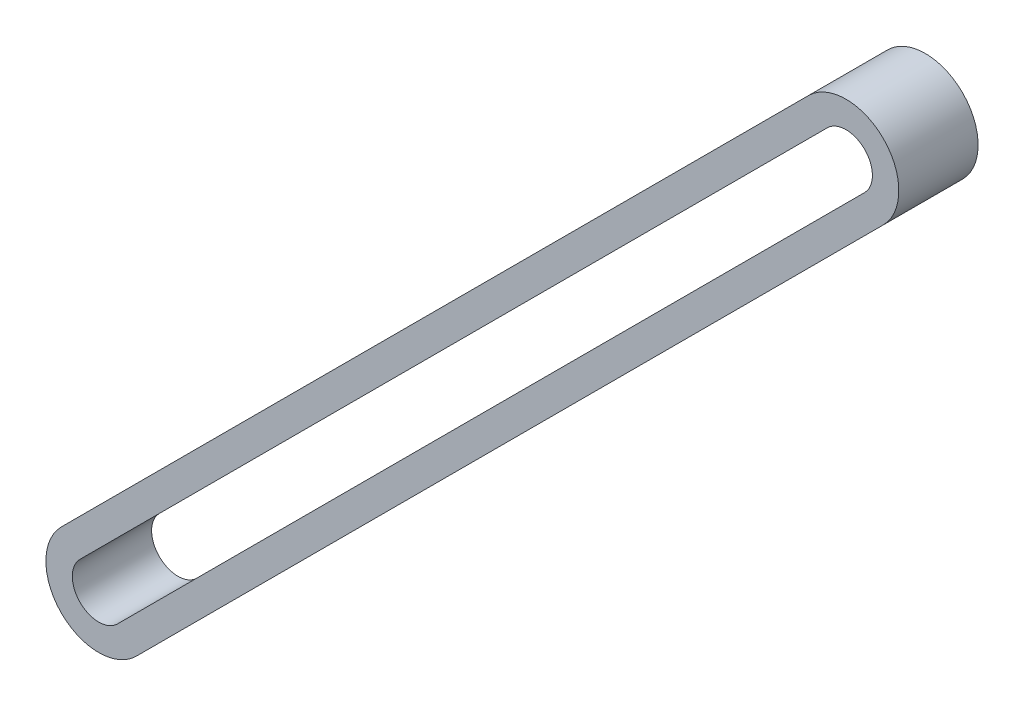
ISO-10303-21;
HEADER;
FILE_DESCRIPTION(('STEP AP214'),'2;1');
FILE_NAME('part.step','',(''),(''),'','','');
FILE_SCHEMA(('AUTOMOTIVE_DESIGN { 1 0 10303 214 1 1 1 1 }'));
ENDSEC;
DATA;
#1=APPLICATION_CONTEXT('core data for automotive mechanical design processes');
#2=APPLICATION_PROTOCOL_DEFINITION('international standard','automotive_design',2000,#1);
#3=PRODUCT_CONTEXT('',#1,'mechanical');
#4=PRODUCT('Part','Part','',(#3));
#5=PRODUCT_RELATED_PRODUCT_CATEGORY('part','',(#4));
#6=PRODUCT_DEFINITION_FORMATION('','',#4);
#7=PRODUCT_DEFINITION_CONTEXT('part definition',#1,'design');
#8=PRODUCT_DEFINITION('design','',#6,#7);
#9=PRODUCT_DEFINITION_SHAPE('','',#8);
#10=(LENGTH_UNIT() NAMED_UNIT(*) SI_UNIT(.MILLI.,.METRE.));
#11=(NAMED_UNIT(*) PLANE_ANGLE_UNIT() SI_UNIT($,.RADIAN.));
#12=(NAMED_UNIT(*) SI_UNIT($,.STERADIAN.) SOLID_ANGLE_UNIT());
#13=UNCERTAINTY_MEASURE_WITH_UNIT(LENGTH_MEASURE(1.E-05),#10,'distance_accuracy_value','');
#14=(GEOMETRIC_REPRESENTATION_CONTEXT(3) GLOBAL_UNCERTAINTY_ASSIGNED_CONTEXT((#13)) GLOBAL_UNIT_ASSIGNED_CONTEXT((#10,
#11,#12)) REPRESENTATION_CONTEXT('',''));
#15=CARTESIAN_POINT('',(0.,0.,0.));
#16=DIRECTION('',(0.,0.,1.));
#17=DIRECTION('',(1.,0.,0.));
#18=AXIS2_PLACEMENT_3D('',#15,#16,#17);
#19=CARTESIAN_POINT('',(0.,0.,3.));
#20=DIRECTION('',(0.,0.,1.));
#21=DIRECTION('',(1.,0.,0.));
#22=AXIS2_PLACEMENT_3D('',#19,#20,#21);
#23=PLANE('',#22);
#24=CARTESIAN_POINT('',(0.,0.,3.));
#25=DIRECTION('',(0.,0.,1.));
#26=DIRECTION('',(1.,0.,0.));
#27=AXIS2_PLACEMENT_3D('',#24,#25,#26);
#28=CIRCLE('',#27,2.);
#29=CARTESIAN_POINT('',(-1.4142135623731,1.41421356237309,3.));
#30=VERTEX_POINT('',#29);
#31=CARTESIAN_POINT('',(1.4142135623731,-1.41421356237309,3.));
#32=VERTEX_POINT('',#31);
#33=EDGE_CURVE('E138',#30,#32,#28,.T.);
#34=ORIENTED_EDGE('',*,*,#33,.T.);
#35=DIRECTION('',(0.707106781186546,0.707106781186549,0.));
#36=VECTOR('',#35,1.);
#37=CARTESIAN_POINT('',(1.4142135623731,-1.41421356237309,3.));
#38=LINE('',#37,#36);
#39=CARTESIAN_POINT('',(29.6984848098349,26.8700576850889,3.));
#40=VERTEX_POINT('',#39);
#41=EDGE_CURVE('E141',#32,#40,#38,.T.);
#42=ORIENTED_EDGE('',*,*,#41,.T.);
#43=CARTESIAN_POINT('',(28.2842712474618,28.284271247462,3.));
#44=DIRECTION('',(0.,0.,1.));
#45=DIRECTION('',(1.,0.,0.));
#46=AXIS2_PLACEMENT_3D('',#43,#44,#45);
#47=CIRCLE('',#46,2.);
#48=CARTESIAN_POINT('',(26.8700576850887,29.6984848098351,3.));
#49=VERTEX_POINT('',#48);
#50=EDGE_CURVE('E144',#40,#49,#47,.T.);
#51=ORIENTED_EDGE('',*,*,#50,.T.);
#52=DIRECTION('',(-0.707106781186546,-0.707106781186549,0.));
#53=VECTOR('',#52,1.);
#54=CARTESIAN_POINT('',(-1.4142135623731,1.41421356237309,3.));
#55=LINE('',#54,#53);
#56=EDGE_CURVE('E146',#49,#30,#55,.T.);
#57=ORIENTED_EDGE('',*,*,#56,.T.);
#58=EDGE_LOOP('',(#34,#42,#51,#57));
#59=FACE_BOUND('',#58,.T.);
#60=DIRECTION('',(0.707106781186546,0.707106781186549,0.));
#61=VECTOR('',#60,1.);
#62=CARTESIAN_POINT('',(0.707106781186549,-0.707106781186546,3.));
#63=LINE('',#62,#61);
#64=CARTESIAN_POINT('',(0.707106781186549,-0.707106781186546,3.));
#65=VERTEX_POINT('',#64);
#66=CARTESIAN_POINT('',(28.9913780286484,27.5771644662754,3.));
#67=VERTEX_POINT('',#66);
#68=EDGE_CURVE('E110',#65,#67,#63,.T.);
#69=ORIENTED_EDGE('',*,*,#68,.F.);
#70=CARTESIAN_POINT('',(0.,0.,3.));
#71=DIRECTION('',(0.,0.,1.));
#72=DIRECTION('',(1.,0.,0.));
#73=AXIS2_PLACEMENT_3D('',#70,#71,#72);
#74=CIRCLE('',#73,1.);
#75=CARTESIAN_POINT('',(-0.707106781186549,0.707106781186546,3.));
#76=VERTEX_POINT('',#75);
#77=EDGE_CURVE('E102',#76,#65,#74,.T.);
#78=ORIENTED_EDGE('',*,*,#77,.F.);
#79=DIRECTION('',(-0.707106781186546,-0.707106781186549,0.));
#80=VECTOR('',#79,1.);
#81=CARTESIAN_POINT('',(-0.707106781186549,0.707106781186546,3.));
#82=LINE('',#81,#80);
#83=CARTESIAN_POINT('',(27.5771644662753,28.9913780286485,3.));
#84=VERTEX_POINT('',#83);
#85=EDGE_CURVE('E124',#84,#76,#82,.T.);
#86=ORIENTED_EDGE('',*,*,#85,.F.);
#87=CARTESIAN_POINT('',(28.2842712474618,28.284271247462,3.));
#88=DIRECTION('',(0.,0.,1.));
#89=DIRECTION('',(1.,0.,0.));
#90=AXIS2_PLACEMENT_3D('',#87,#88,#89);
#91=CIRCLE('',#90,1.);
#92=EDGE_CURVE('E122',#67,#84,#91,.T.);
#93=ORIENTED_EDGE('',*,*,#92,.F.);
#94=EDGE_LOOP('',(#69,#78,#86,#93));
#95=FACE_BOUND('',#94,.T.);
#96=ADVANCED_FACE('F37',(#59,#95),#23,.T.);
#97=CARTESIAN_POINT('',(0.,0.,0.));
#98=DIRECTION('',(0.,0.,1.));
#99=DIRECTION('',(1.,0.,0.));
#100=AXIS2_PLACEMENT_3D('',#97,#98,#99);
#101=PLANE('',#100);
#102=CARTESIAN_POINT('',(0.,0.,0.));
#103=DIRECTION('',(0.,0.,1.));
#104=DIRECTION('',(1.,0.,0.));
#105=AXIS2_PLACEMENT_3D('',#102,#103,#104);
#106=CIRCLE('',#105,2.);
#107=CARTESIAN_POINT('',(-1.4142135623731,1.41421356237309,0.));
#108=VERTEX_POINT('',#107);
#109=CARTESIAN_POINT('',(1.4142135623731,-1.41421356237309,0.));
#110=VERTEX_POINT('',#109);
#111=EDGE_CURVE('E118',#108,#110,#106,.T.);
#112=ORIENTED_EDGE('',*,*,#111,.F.);
#113=DIRECTION('',(-0.707106781186546,-0.707106781186549,0.));
#114=VECTOR('',#113,1.);
#115=CARTESIAN_POINT('',(-1.4142135623731,1.41421356237309,0.));
#116=LINE('',#115,#114);
#117=CARTESIAN_POINT('',(26.8700576850887,29.6984848098351,0.));
#118=VERTEX_POINT('',#117);
#119=EDGE_CURVE('E142',#118,#108,#116,.T.);
#120=ORIENTED_EDGE('',*,*,#119,.F.);
#121=CARTESIAN_POINT('',(28.2842712474618,28.284271247462,0.));
#122=DIRECTION('',(0.,0.,1.));
#123=DIRECTION('',(1.,0.,0.));
#124=AXIS2_PLACEMENT_3D('',#121,#122,#123);
#125=CIRCLE('',#124,2.);
#126=CARTESIAN_POINT('',(29.6984848098349,26.8700576850889,0.));
#127=VERTEX_POINT('',#126);
#128=EDGE_CURVE('E153',#127,#118,#125,.T.);
#129=ORIENTED_EDGE('',*,*,#128,.F.);
#130=DIRECTION('',(0.707106781186546,0.707106781186549,0.));
#131=VECTOR('',#130,1.);
#132=CARTESIAN_POINT('',(1.4142135623731,-1.41421356237309,0.));
#133=LINE('',#132,#131);
#134=EDGE_CURVE('E151',#110,#127,#133,.T.);
#135=ORIENTED_EDGE('',*,*,#134,.F.);
#136=EDGE_LOOP('',(#112,#120,#129,#135));
#137=FACE_BOUND('',#136,.T.);
#138=CARTESIAN_POINT('',(0.,0.,0.));
#139=DIRECTION('',(0.,0.,1.));
#140=DIRECTION('',(1.,0.,0.));
#141=AXIS2_PLACEMENT_3D('',#138,#139,#140);
#142=CIRCLE('',#141,1.);
#143=CARTESIAN_POINT('',(-0.707106781186549,0.707106781186546,0.));
#144=VERTEX_POINT('',#143);
#145=CARTESIAN_POINT('',(0.707106781186549,-0.707106781186546,0.));
#146=VERTEX_POINT('',#145);
#147=EDGE_CURVE('E60',#144,#146,#142,.T.);
#148=ORIENTED_EDGE('',*,*,#147,.T.);
#149=DIRECTION('',(0.707106781186546,0.707106781186549,0.));
#150=VECTOR('',#149,1.);
#151=CARTESIAN_POINT('',(0.707106781186549,-0.707106781186546,0.));
#152=LINE('',#151,#150);
#153=CARTESIAN_POINT('',(28.9913780286484,27.5771644662754,0.));
#154=VERTEX_POINT('',#153);
#155=EDGE_CURVE('E117',#146,#154,#152,.T.);
#156=ORIENTED_EDGE('',*,*,#155,.T.);
#157=CARTESIAN_POINT('',(28.2842712474618,28.284271247462,0.));
#158=DIRECTION('',(0.,0.,1.));
#159=DIRECTION('',(1.,0.,0.));
#160=AXIS2_PLACEMENT_3D('',#157,#158,#159);
#161=CIRCLE('',#160,1.);
#162=CARTESIAN_POINT('',(27.5771644662753,28.9913780286485,0.));
#163=VERTEX_POINT('',#162);
#164=EDGE_CURVE('E130',#154,#163,#161,.T.);
#165=ORIENTED_EDGE('',*,*,#164,.T.);
#166=DIRECTION('',(-0.707106781186546,-0.707106781186549,0.));
#167=VECTOR('',#166,1.);
#168=CARTESIAN_POINT('',(-0.707106781186549,0.707106781186546,0.));
#169=LINE('',#168,#167);
#170=EDGE_CURVE('E111',#163,#144,#169,.T.);
#171=ORIENTED_EDGE('',*,*,#170,.T.);
#172=EDGE_LOOP('',(#148,#156,#165,#171));
#173=FACE_BOUND('',#172,.T.);
#174=ADVANCED_FACE('F171',(#137,#173),#101,.F.);
#175=CARTESIAN_POINT('',(0.,0.,3.));
#176=DIRECTION('',(0.,0.,-1.));
#177=DIRECTION('',(-1.,0.,0.));
#178=AXIS2_PLACEMENT_3D('',#175,#176,#177);
#179=CYLINDRICAL_SURFACE('',#178,2.);
#180=ORIENTED_EDGE('',*,*,#111,.T.);
#181=DIRECTION('',(0.,0.,-1.));
#182=VECTOR('',#181,1.);
#183=CARTESIAN_POINT('',(1.4142135623731,-1.41421356237309,3.));
#184=LINE('',#183,#182);
#185=EDGE_CURVE('E11',#32,#110,#184,.T.);
#186=ORIENTED_EDGE('',*,*,#185,.F.);
#187=ORIENTED_EDGE('',*,*,#33,.F.);
#188=DIRECTION('',(0.,0.,-1.));
#189=VECTOR('',#188,1.);
#190=CARTESIAN_POINT('',(-1.4142135623731,1.41421356237309,3.));
#191=LINE('',#190,#189);
#192=EDGE_CURVE('E148',#30,#108,#191,.T.);
#193=ORIENTED_EDGE('',*,*,#192,.T.);
#194=EDGE_LOOP('',(#180,#186,#187,#193));
#195=FACE_BOUND('',#194,.T.);
#196=ADVANCED_FACE('F39',(#195),#179,.T.);
#197=CARTESIAN_POINT('',(1.4142135623731,-1.41421356237309,3.));
#198=DIRECTION('',(-0.707106781186549,0.707106781186546,0.));
#199=DIRECTION('',(-0.707106781186546,-0.707106781186549,0.));
#200=AXIS2_PLACEMENT_3D('',#197,#198,#199);
#201=PLANE('',#200);
#202=ORIENTED_EDGE('',*,*,#134,.T.);
#203=DIRECTION('',(0.,0.,-1.));
#204=VECTOR('',#203,1.);
#205=CARTESIAN_POINT('',(29.6984848098349,26.8700576850889,3.));
#206=LINE('',#205,#204);
#207=EDGE_CURVE('E45',#40,#127,#206,.T.);
#208=ORIENTED_EDGE('',*,*,#207,.F.);
#209=ORIENTED_EDGE('',*,*,#41,.F.);
#210=ORIENTED_EDGE('',*,*,#185,.T.);
#211=EDGE_LOOP('',(#202,#208,#209,#210));
#212=FACE_BOUND('',#211,.T.);
#213=ADVANCED_FACE('F181',(#212),#201,.F.);
#214=CARTESIAN_POINT('',(28.2842712474618,28.284271247462,3.));
#215=DIRECTION('',(0.,0.,-1.));
#216=DIRECTION('',(-1.,0.,0.));
#217=AXIS2_PLACEMENT_3D('',#214,#215,#216);
#218=CYLINDRICAL_SURFACE('',#217,2.);
#219=ORIENTED_EDGE('',*,*,#128,.T.);
#220=DIRECTION('',(0.,0.,-1.));
#221=VECTOR('',#220,1.);
#222=CARTESIAN_POINT('',(26.8700576850887,29.6984848098351,3.));
#223=LINE('',#222,#221);
#224=EDGE_CURVE('E158',#49,#118,#223,.T.);
#225=ORIENTED_EDGE('',*,*,#224,.F.);
#226=ORIENTED_EDGE('',*,*,#50,.F.);
#227=ORIENTED_EDGE('',*,*,#207,.T.);
#228=EDGE_LOOP('',(#219,#225,#226,#227));
#229=FACE_BOUND('',#228,.T.);
#230=ADVANCED_FACE('F165',(#229),#218,.T.);
#231=CARTESIAN_POINT('',(-1.4142135623731,1.41421356237309,3.));
#232=DIRECTION('',(0.707106781186549,-0.707106781186546,0.));
#233=DIRECTION('',(0.707106781186546,0.707106781186549,0.));
#234=AXIS2_PLACEMENT_3D('',#231,#232,#233);
#235=PLANE('',#234);
#236=ORIENTED_EDGE('',*,*,#119,.T.);
#237=ORIENTED_EDGE('',*,*,#192,.F.);
#238=ORIENTED_EDGE('',*,*,#56,.F.);
#239=ORIENTED_EDGE('',*,*,#224,.T.);
#240=EDGE_LOOP('',(#236,#237,#238,#239));
#241=FACE_BOUND('',#240,.T.);
#242=ADVANCED_FACE('F175',(#241),#235,.F.);
#243=CARTESIAN_POINT('',(0.,0.,3.));
#244=DIRECTION('',(0.,0.,-1.));
#245=DIRECTION('',(-1.,0.,0.));
#246=AXIS2_PLACEMENT_3D('',#243,#244,#245);
#247=CYLINDRICAL_SURFACE('',#246,1.);
#248=ORIENTED_EDGE('',*,*,#147,.F.);
#249=DIRECTION('',(0.,0.,-1.));
#250=VECTOR('',#249,1.);
#251=CARTESIAN_POINT('',(-0.707106781186549,0.707106781186546,3.));
#252=LINE('',#251,#250);
#253=EDGE_CURVE('E106',#76,#144,#252,.T.);
#254=ORIENTED_EDGE('',*,*,#253,.F.);
#255=ORIENTED_EDGE('',*,*,#77,.T.);
#256=DIRECTION('',(0.,0.,-1.));
#257=VECTOR('',#256,1.);
#258=CARTESIAN_POINT('',(0.707106781186549,-0.707106781186546,3.));
#259=LINE('',#258,#257);
#260=EDGE_CURVE('E105',#65,#146,#259,.T.);
#261=ORIENTED_EDGE('',*,*,#260,.T.);
#262=EDGE_LOOP('',(#248,#254,#255,#261));
#263=FACE_BOUND('',#262,.T.);
#264=ADVANCED_FACE('F104',(#263),#247,.F.);
#265=CARTESIAN_POINT('',(0.707106781186549,-0.707106781186546,3.));
#266=DIRECTION('',(-0.707106781186549,0.707106781186546,0.));
#267=DIRECTION('',(-0.707106781186546,-0.707106781186549,0.));
#268=AXIS2_PLACEMENT_3D('',#265,#266,#267);
#269=PLANE('',#268);
#270=ORIENTED_EDGE('',*,*,#155,.F.);
#271=ORIENTED_EDGE('',*,*,#260,.F.);
#272=ORIENTED_EDGE('',*,*,#68,.T.);
#273=DIRECTION('',(0.,0.,-1.));
#274=VECTOR('',#273,1.);
#275=CARTESIAN_POINT('',(28.9913780286484,27.5771644662754,3.));
#276=LINE('',#275,#274);
#277=EDGE_CURVE('E119',#67,#154,#276,.T.);
#278=ORIENTED_EDGE('',*,*,#277,.T.);
#279=EDGE_LOOP('',(#270,#271,#272,#278));
#280=FACE_BOUND('',#279,.T.);
#281=ADVANCED_FACE('F114',(#280),#269,.T.);
#282=CARTESIAN_POINT('',(28.2842712474618,28.284271247462,3.));
#283=DIRECTION('',(0.,0.,-1.));
#284=DIRECTION('',(-1.,0.,0.));
#285=AXIS2_PLACEMENT_3D('',#282,#283,#284);
#286=CYLINDRICAL_SURFACE('',#285,1.);
#287=ORIENTED_EDGE('',*,*,#164,.F.);
#288=ORIENTED_EDGE('',*,*,#277,.F.);
#289=ORIENTED_EDGE('',*,*,#92,.T.);
#290=DIRECTION('',(0.,0.,-1.));
#291=VECTOR('',#290,1.);
#292=CARTESIAN_POINT('',(27.5771644662753,28.9913780286485,3.));
#293=LINE('',#292,#291);
#294=EDGE_CURVE('E52',#84,#163,#293,.T.);
#295=ORIENTED_EDGE('',*,*,#294,.T.);
#296=EDGE_LOOP('',(#287,#288,#289,#295));
#297=FACE_BOUND('',#296,.T.);
#298=ADVANCED_FACE('F204',(#297),#286,.F.);
#299=CARTESIAN_POINT('',(-0.707106781186549,0.707106781186546,3.));
#300=DIRECTION('',(0.707106781186549,-0.707106781186546,0.));
#301=DIRECTION('',(0.707106781186546,0.707106781186549,0.));
#302=AXIS2_PLACEMENT_3D('',#299,#300,#301);
#303=PLANE('',#302);
#304=ORIENTED_EDGE('',*,*,#170,.F.);
#305=ORIENTED_EDGE('',*,*,#294,.F.);
#306=ORIENTED_EDGE('',*,*,#85,.T.);
#307=ORIENTED_EDGE('',*,*,#253,.T.);
#308=EDGE_LOOP('',(#304,#305,#306,#307));
#309=FACE_BOUND('',#308,.T.);
#310=ADVANCED_FACE('F208',(#309),#303,.T.);
#311=CLOSED_SHELL('',(#96,#174,#196,#213,#230,#242,#264,#281,#298,#310));
#312=MANIFOLD_SOLID_BREP('B2',#311);
#313=ADVANCED_BREP_SHAPE_REPRESENTATION('',(#18,#312),#14);
#314=SHAPE_DEFINITION_REPRESENTATION(#9,#313);
ENDSEC;
END-ISO-10303-21;
